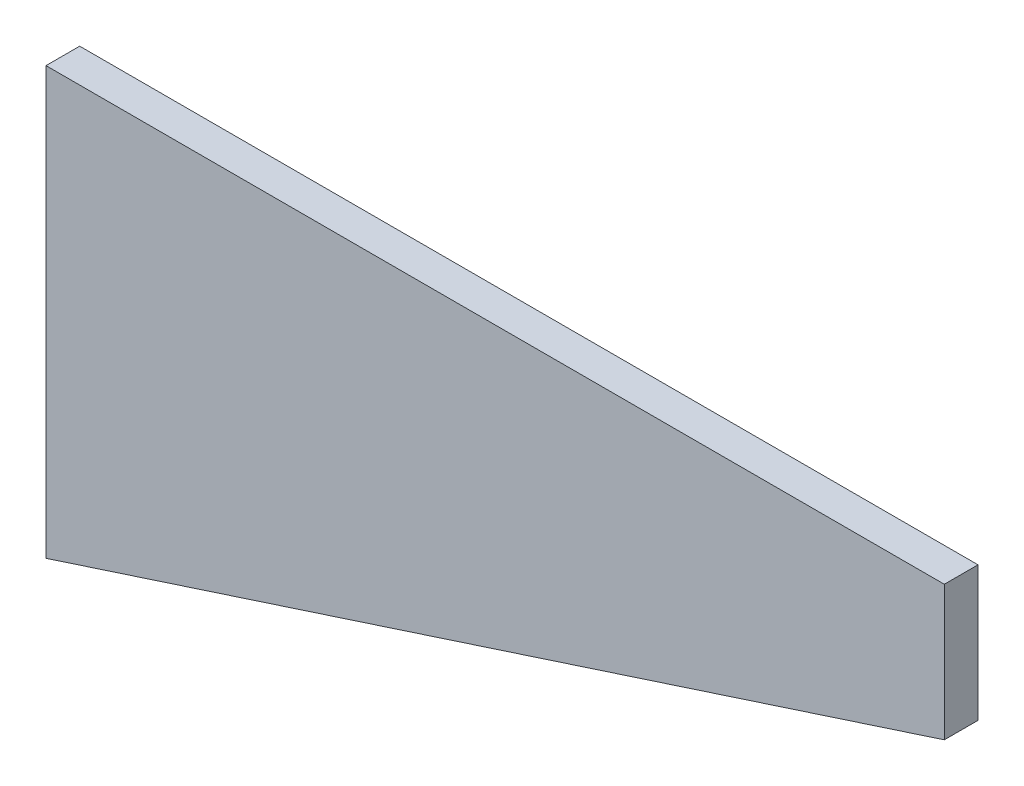
ISO-10303-21;
HEADER;
FILE_DESCRIPTION(('STEP AP214'),'2;1');
FILE_NAME('part.step','',(''),(''),'','','');
FILE_SCHEMA(('AUTOMOTIVE_DESIGN { 1 0 10303 214 1 1 1 1 }'));
ENDSEC;
DATA;
#1=APPLICATION_CONTEXT('core data for automotive mechanical design processes');
#2=APPLICATION_PROTOCOL_DEFINITION('international standard','automotive_design',2000,#1);
#3=PRODUCT_CONTEXT('',#1,'mechanical');
#4=PRODUCT('Part','Part','',(#3));
#5=PRODUCT_RELATED_PRODUCT_CATEGORY('part','',(#4));
#6=PRODUCT_DEFINITION_FORMATION('','',#4);
#7=PRODUCT_DEFINITION_CONTEXT('part definition',#1,'design');
#8=PRODUCT_DEFINITION('design','',#6,#7);
#9=PRODUCT_DEFINITION_SHAPE('','',#8);
#10=(LENGTH_UNIT() NAMED_UNIT(*) SI_UNIT(.MILLI.,.METRE.));
#11=(NAMED_UNIT(*) PLANE_ANGLE_UNIT() SI_UNIT($,.RADIAN.));
#12=(NAMED_UNIT(*) SI_UNIT($,.STERADIAN.) SOLID_ANGLE_UNIT());
#13=UNCERTAINTY_MEASURE_WITH_UNIT(LENGTH_MEASURE(1.E-05),#10,'distance_accuracy_value','');
#14=(GEOMETRIC_REPRESENTATION_CONTEXT(3) GLOBAL_UNCERTAINTY_ASSIGNED_CONTEXT((#13)) GLOBAL_UNIT_ASSIGNED_CONTEXT((#10,
#11,#12)) REPRESENTATION_CONTEXT('',''));
#15=CARTESIAN_POINT('',(0.,0.,0.));
#16=DIRECTION('',(0.,0.,1.));
#17=DIRECTION('',(1.,0.,0.));
#18=AXIS2_PLACEMENT_3D('',#15,#16,#17);
#19=CARTESIAN_POINT('',(0.,-659.409867616983,-15.));
#20=DIRECTION('',(-1.,0.,0.));
#21=DIRECTION('',(0.,-1.,0.));
#22=AXIS2_PLACEMENT_3D('',#19,#20,#21);
#23=PLANE('',#22);
#24=DIRECTION('',(0.,-1.,0.));
#25=VECTOR('',#24,1.);
#26=CARTESIAN_POINT('',(0.,-659.409867616983,0.));
#27=LINE('',#26,#25);
#28=CARTESIAN_POINT('',(0.,-469.409867616983,0.));
#29=VERTEX_POINT('',#28);
#30=CARTESIAN_POINT('',(0.,-659.409867616983,0.));
#31=VERTEX_POINT('',#30);
#32=EDGE_CURVE('E102',#29,#31,#27,.T.);
#33=ORIENTED_EDGE('',*,*,#32,.F.);
#34=DIRECTION('',(0.,0.,1.));
#35=VECTOR('',#34,1.);
#36=CARTESIAN_POINT('',(0.,-469.409867616983,-15.));
#37=LINE('',#36,#35);
#38=CARTESIAN_POINT('',(0.,-469.409867616983,-15.));
#39=VERTEX_POINT('',#38);
#40=EDGE_CURVE('E11',#39,#29,#37,.T.);
#41=ORIENTED_EDGE('',*,*,#40,.F.);
#42=DIRECTION('',(0.,-1.,0.));
#43=VECTOR('',#42,1.);
#44=CARTESIAN_POINT('',(0.,-659.409867616983,-15.));
#45=LINE('',#44,#43);
#46=CARTESIAN_POINT('',(0.,-659.409867616983,-15.));
#47=VERTEX_POINT('',#46);
#48=EDGE_CURVE('E96',#39,#47,#45,.T.);
#49=ORIENTED_EDGE('',*,*,#48,.T.);
#50=DIRECTION('',(0.,0.,1.));
#51=VECTOR('',#50,1.);
#52=CARTESIAN_POINT('',(0.,-659.409867616983,-15.));
#53=LINE('',#52,#51);
#54=EDGE_CURVE('E41',#47,#31,#53,.T.);
#55=ORIENTED_EDGE('',*,*,#54,.T.);
#56=EDGE_LOOP('',(#33,#41,#49,#55));
#57=FACE_BOUND('',#56,.T.);
#58=ADVANCED_FACE('F38',(#57),#23,.T.);
#59=CARTESIAN_POINT('',(0.,-469.409867616983,-15.));
#60=DIRECTION('',(0.,1.,0.));
#61=DIRECTION('',(0.,0.,1.));
#62=AXIS2_PLACEMENT_3D('',#59,#60,#61);
#63=PLANE('',#62);
#64=DIRECTION('',(-1.,0.,0.));
#65=VECTOR('',#64,1.);
#66=CARTESIAN_POINT('',(0.,-469.409867616983,0.));
#67=LINE('',#66,#65);
#68=CARTESIAN_POINT('',(400.,-469.409867616983,0.));
#69=VERTEX_POINT('',#68);
#70=EDGE_CURVE('E98',#69,#29,#67,.T.);
#71=ORIENTED_EDGE('',*,*,#70,.F.);
#72=DIRECTION('',(0.,0.,1.));
#73=VECTOR('',#72,1.);
#74=CARTESIAN_POINT('',(400.,-469.409867616983,-15.));
#75=LINE('',#74,#73);
#76=CARTESIAN_POINT('',(400.,-469.409867616983,-15.));
#77=VERTEX_POINT('',#76);
#78=EDGE_CURVE('E47',#77,#69,#75,.T.);
#79=ORIENTED_EDGE('',*,*,#78,.F.);
#80=DIRECTION('',(-1.,0.,0.));
#81=VECTOR('',#80,1.);
#82=CARTESIAN_POINT('',(0.,-469.409867616983,-15.));
#83=LINE('',#82,#81);
#84=EDGE_CURVE('E93',#77,#39,#83,.T.);
#85=ORIENTED_EDGE('',*,*,#84,.T.);
#86=ORIENTED_EDGE('',*,*,#40,.T.);
#87=EDGE_LOOP('',(#71,#79,#85,#86));
#88=FACE_BOUND('',#87,.T.);
#89=ADVANCED_FACE('F112',(#88),#63,.T.);
#90=CARTESIAN_POINT('',(400.,-469.409867616983,-15.));
#91=DIRECTION('',(1.,0.,0.));
#92=DIRECTION('',(0.,0.,-1.));
#93=AXIS2_PLACEMENT_3D('',#90,#91,#92);
#94=PLANE('',#93);
#95=DIRECTION('',(0.,1.,0.));
#96=VECTOR('',#95,1.);
#97=CARTESIAN_POINT('',(400.,-469.409867616983,0.));
#98=LINE('',#97,#96);
#99=CARTESIAN_POINT('',(400.,-529.409867616983,0.));
#100=VERTEX_POINT('',#99);
#101=EDGE_CURVE('E88',#100,#69,#98,.T.);
#102=ORIENTED_EDGE('',*,*,#101,.F.);
#103=DIRECTION('',(0.,0.,1.));
#104=VECTOR('',#103,1.);
#105=CARTESIAN_POINT('',(400.,-529.409867616983,-15.));
#106=LINE('',#105,#104);
#107=CARTESIAN_POINT('',(400.,-529.409867616983,-15.));
#108=VERTEX_POINT('',#107);
#109=EDGE_CURVE('E83',#108,#100,#106,.T.);
#110=ORIENTED_EDGE('',*,*,#109,.F.);
#111=DIRECTION('',(0.,1.,0.));
#112=VECTOR('',#111,1.);
#113=CARTESIAN_POINT('',(400.,-469.409867616983,-15.));
#114=LINE('',#113,#112);
#115=EDGE_CURVE('E86',#108,#77,#114,.T.);
#116=ORIENTED_EDGE('',*,*,#115,.T.);
#117=ORIENTED_EDGE('',*,*,#78,.T.);
#118=EDGE_LOOP('',(#102,#110,#116,#117));
#119=FACE_BOUND('',#118,.T.);
#120=ADVANCED_FACE('F85',(#119),#94,.T.);
#121=CARTESIAN_POINT('',(400.,-529.409867616983,-15.));
#122=DIRECTION('',(0.309086072337558,-0.951034068730948,0.));
#123=DIRECTION('',(0.951034068730948,0.309086072337558,0.));
#124=AXIS2_PLACEMENT_3D('',#121,#122,#123);
#125=PLANE('',#124);
#126=DIRECTION('',(0.951034068730948,0.309086072337558,0.));
#127=VECTOR('',#126,1.);
#128=CARTESIAN_POINT('',(400.,-529.409867616983,0.));
#129=LINE('',#128,#127);
#130=EDGE_CURVE('E105',#31,#100,#129,.T.);
#131=ORIENTED_EDGE('',*,*,#130,.F.);
#132=ORIENTED_EDGE('',*,*,#54,.F.);
#133=DIRECTION('',(0.951034068730948,0.309086072337558,0.));
#134=VECTOR('',#133,1.);
#135=CARTESIAN_POINT('',(400.,-529.409867616983,-15.));
#136=LINE('',#135,#134);
#137=EDGE_CURVE('E92',#47,#108,#136,.T.);
#138=ORIENTED_EDGE('',*,*,#137,.T.);
#139=ORIENTED_EDGE('',*,*,#109,.T.);
#140=EDGE_LOOP('',(#131,#132,#138,#139));
#141=FACE_BOUND('',#140,.T.);
#142=ADVANCED_FACE('F95',(#141),#125,.T.);
#143=CARTESIAN_POINT('',(0.,0.,-15.));
#144=DIRECTION('',(0.,0.,-1.));
#145=DIRECTION('',(-1.,0.,0.));
#146=AXIS2_PLACEMENT_3D('',#143,#144,#145);
#147=PLANE('',#146);
#148=ORIENTED_EDGE('',*,*,#48,.F.);
#149=ORIENTED_EDGE('',*,*,#84,.F.);
#150=ORIENTED_EDGE('',*,*,#115,.F.);
#151=ORIENTED_EDGE('',*,*,#137,.F.);
#152=EDGE_LOOP('',(#148,#149,#150,#151));
#153=FACE_BOUND('',#152,.T.);
#154=ADVANCED_FACE('F91',(#153),#147,.T.);
#155=CARTESIAN_POINT('',(0.,0.,0.));
#156=DIRECTION('',(0.,0.,-1.));
#157=DIRECTION('',(-1.,0.,0.));
#158=AXIS2_PLACEMENT_3D('',#155,#156,#157);
#159=PLANE('',#158);
#160=ORIENTED_EDGE('',*,*,#32,.T.);
#161=ORIENTED_EDGE('',*,*,#130,.T.);
#162=ORIENTED_EDGE('',*,*,#101,.T.);
#163=ORIENTED_EDGE('',*,*,#70,.T.);
#164=EDGE_LOOP('',(#160,#161,#162,#163));
#165=FACE_BOUND('',#164,.T.);
#166=ADVANCED_FACE('F111',(#165),#159,.F.);
#167=CLOSED_SHELL('',(#58,#89,#120,#142,#154,#166));
#168=MANIFOLD_SOLID_BREP('B2',#167);
#169=ADVANCED_BREP_SHAPE_REPRESENTATION('',(#18,#168),#14);
#170=SHAPE_DEFINITION_REPRESENTATION(#9,#169);
ENDSEC;
END-ISO-10303-21;
